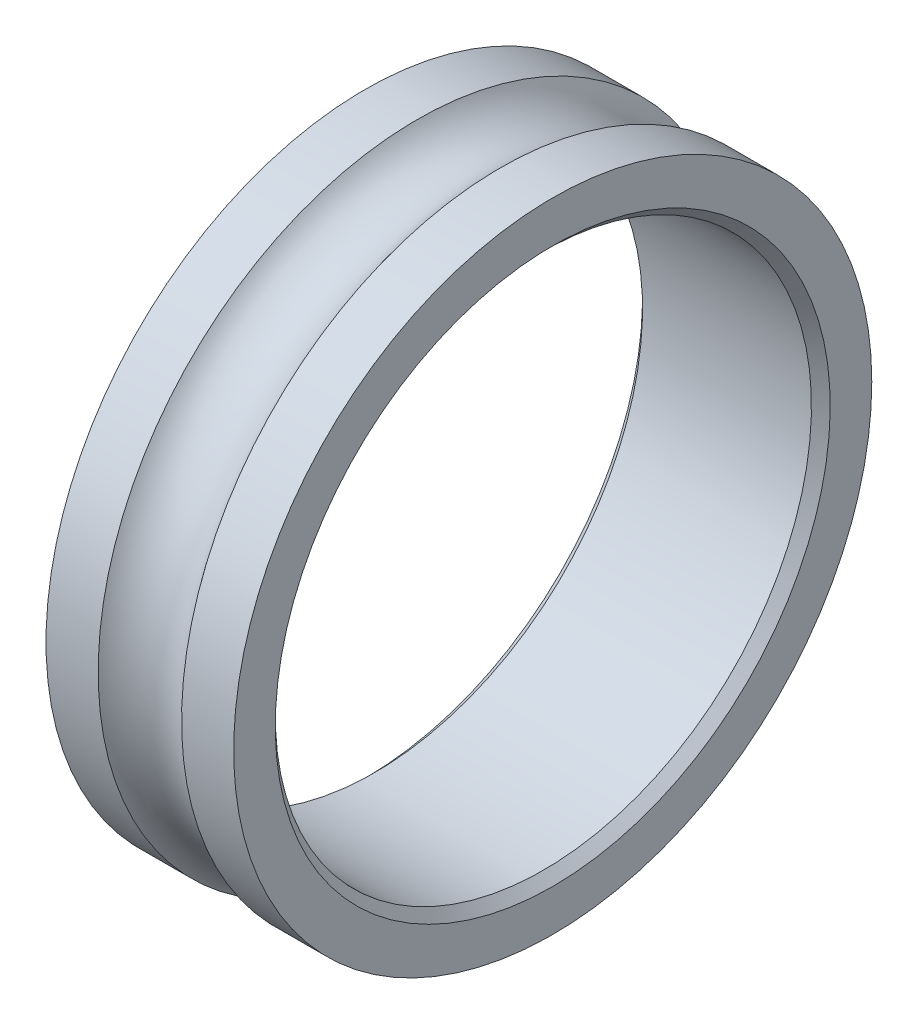
ISO-10303-21;
HEADER;
FILE_DESCRIPTION(('STEP AP214'),'2;1');
FILE_NAME('part.step','',(''),(''),'','','');
FILE_SCHEMA(('AUTOMOTIVE_DESIGN { 1 0 10303 214 1 1 1 1 }'));
ENDSEC;
DATA;
#1=APPLICATION_CONTEXT('core data for automotive mechanical design processes');
#2=APPLICATION_PROTOCOL_DEFINITION('international standard','automotive_design',2000,#1);
#3=PRODUCT_CONTEXT('',#1,'mechanical');
#4=PRODUCT('Part','Part','',(#3));
#5=PRODUCT_RELATED_PRODUCT_CATEGORY('part','',(#4));
#6=PRODUCT_DEFINITION_FORMATION('','',#4);
#7=PRODUCT_DEFINITION_CONTEXT('part definition',#1,'design');
#8=PRODUCT_DEFINITION('design','',#6,#7);
#9=PRODUCT_DEFINITION_SHAPE('','',#8);
#10=(LENGTH_UNIT() NAMED_UNIT(*) SI_UNIT(.MILLI.,.METRE.));
#11=(NAMED_UNIT(*) PLANE_ANGLE_UNIT() SI_UNIT($,.RADIAN.));
#12=(NAMED_UNIT(*) SI_UNIT($,.STERADIAN.) SOLID_ANGLE_UNIT());
#13=UNCERTAINTY_MEASURE_WITH_UNIT(LENGTH_MEASURE(1.E-05),#10,'distance_accuracy_value','');
#14=(GEOMETRIC_REPRESENTATION_CONTEXT(3) GLOBAL_UNCERTAINTY_ASSIGNED_CONTEXT((#13)) GLOBAL_UNIT_ASSIGNED_CONTEXT((#10,
#11,#12)) REPRESENTATION_CONTEXT('',''));
#15=CARTESIAN_POINT('',(0.,0.,0.));
#16=DIRECTION('',(0.,0.,1.));
#17=DIRECTION('',(1.,0.,0.));
#18=AXIS2_PLACEMENT_3D('',#15,#16,#17);
#19=CARTESIAN_POINT('',(4.525,0.,0.));
#20=DIRECTION('',(1.,0.,0.));
#21=DIRECTION('',(0.,0.963910606013732,-0.266226113697059));
#22=AXIS2_PLACEMENT_3D('',#19,#20,#21);
#23=TOROIDAL_SURFACE('',#22,13.,1.90455682813241);
#24=CARTESIAN_POINT('',(6.08055555555556,0.,0.));
#25=DIRECTION('',(1.,0.,0.));
#26=DIRECTION('',(0.,0.963910606013732,-0.266226113697059));
#27=AXIS2_PLACEMENT_3D('',#24,#25,#26);
#28=CIRCLE('',#27,11.9010989010989);
#29=CARTESIAN_POINT('',(6.08055555555556,11.4715954539876,-3.1683833091639));
#30=VERTEX_POINT('',#29);
#31=EDGE_CURVE('E40',#30,#30,#28,.T.);
#32=ORIENTED_EDGE('',*,*,#31,.F.);
#33=EDGE_LOOP('',(#32));
#34=FACE_BOUND('',#33,.T.);
#35=CARTESIAN_POINT('',(2.96944444444445,0.,0.));
#36=DIRECTION('',(1.,0.,0.));
#37=DIRECTION('',(0.,0.963910606013732,-0.266226113697059));
#38=AXIS2_PLACEMENT_3D('',#35,#36,#37);
#39=CIRCLE('',#38,11.9010989010989);
#40=CARTESIAN_POINT('',(2.96944444444445,11.4715954539876,-3.1683833091639));
#41=VERTEX_POINT('',#40);
#42=EDGE_CURVE('E32',#41,#41,#39,.T.);
#43=ORIENTED_EDGE('',*,*,#42,.T.);
#44=EDGE_LOOP('',(#43));
#45=FACE_BOUND('',#44,.T.);
#46=ADVANCED_FACE('F15',(#34,#45),#23,.F.);
#47=CARTESIAN_POINT('',(8.025,0.,0.));
#48=DIRECTION('',(1.,0.,0.));
#49=DIRECTION('',(0.,0.963910606013732,-0.266226113697059));
#50=AXIS2_PLACEMENT_3D('',#47,#48,#49);
#51=CONICAL_SURFACE('',#50,10.35,0.785398163397452);
#52=CARTESIAN_POINT('',(7.675,0.,0.));
#53=DIRECTION('',(1.,0.,0.));
#54=DIRECTION('',(0.,0.963910606013732,-0.266226113697059));
#55=AXIS2_PLACEMENT_3D('',#52,#53,#54);
#56=CIRCLE('',#55,10.);
#57=CARTESIAN_POINT('',(7.675,9.63910606013732,-2.66226113697059));
#58=VERTEX_POINT('',#57);
#59=EDGE_CURVE('E10',#58,#58,#56,.T.);
#60=ORIENTED_EDGE('',*,*,#59,.F.);
#61=EDGE_LOOP('',(#60));
#62=FACE_BOUND('',#61,.T.);
#63=CARTESIAN_POINT('',(8.025,0.,0.));
#64=DIRECTION('',(1.,0.,0.));
#65=DIRECTION('',(0.,0.963910606013732,-0.266226113697059));
#66=AXIS2_PLACEMENT_3D('',#63,#64,#65);
#67=CIRCLE('',#66,10.35);
#68=CARTESIAN_POINT('',(8.025,9.97647477224213,-2.75544027676456));
#69=VERTEX_POINT('',#68);
#70=EDGE_CURVE('E45',#69,#69,#67,.T.);
#71=ORIENTED_EDGE('',*,*,#70,.T.);
#72=EDGE_LOOP('',(#71));
#73=FACE_BOUND('',#72,.T.);
#74=ADVANCED_FACE('F17',(#62,#73),#51,.F.);
#75=CARTESIAN_POINT('',(8.025,0.,0.));
#76=DIRECTION('',(1.,0.,0.));
#77=DIRECTION('',(0.,0.963910606013732,-0.266226113697059));
#78=AXIS2_PLACEMENT_3D('',#75,#76,#77);
#79=CYLINDRICAL_SURFACE('',#78,10.);
#80=CARTESIAN_POINT('',(1.375,0.,0.));
#81=DIRECTION('',(1.,0.,0.));
#82=DIRECTION('',(0.,0.963910606013732,-0.266226113697059));
#83=AXIS2_PLACEMENT_3D('',#80,#81,#82);
#84=CIRCLE('',#83,10.);
#85=CARTESIAN_POINT('',(1.375,9.63910606013732,-2.66226113697059));
#86=VERTEX_POINT('',#85);
#87=EDGE_CURVE('E23',#86,#86,#84,.T.);
#88=ORIENTED_EDGE('',*,*,#87,.F.);
#89=EDGE_LOOP('',(#88));
#90=FACE_BOUND('',#89,.T.);
#91=ORIENTED_EDGE('',*,*,#59,.T.);
#92=EDGE_LOOP('',(#91));
#93=FACE_BOUND('',#92,.T.);
#94=ADVANCED_FACE('F69',(#90,#93),#79,.F.);
#95=CARTESIAN_POINT('',(1.375,0.,0.));
#96=DIRECTION('',(-1.,0.,0.));
#97=DIRECTION('',(0.,-0.963910606013732,0.266226113697059));
#98=AXIS2_PLACEMENT_3D('',#95,#96,#97);
#99=CONICAL_SURFACE('',#98,10.,0.785398163397446);
#100=ORIENTED_EDGE('',*,*,#87,.T.);
#101=EDGE_LOOP('',(#100));
#102=FACE_BOUND('',#101,.T.);
#103=CARTESIAN_POINT('',(1.025,0.,0.));
#104=DIRECTION('',(1.,0.,0.));
#105=DIRECTION('',(0.,0.963910606013732,-0.266226113697059));
#106=AXIS2_PLACEMENT_3D('',#103,#104,#105);
#107=CIRCLE('',#106,10.35);
#108=CARTESIAN_POINT('',(1.025,9.97647477224213,-2.75544027676456));
#109=VERTEX_POINT('',#108);
#110=EDGE_CURVE('E54',#109,#109,#107,.T.);
#111=ORIENTED_EDGE('',*,*,#110,.F.);
#112=EDGE_LOOP('',(#111));
#113=FACE_BOUND('',#112,.T.);
#114=ADVANCED_FACE('F66',(#102,#113),#99,.F.);
#115=CARTESIAN_POINT('',(8.025,0.,0.));
#116=DIRECTION('',(1.,0.,0.));
#117=DIRECTION('',(0.,0.963910606013732,-0.266226113697059));
#118=AXIS2_PLACEMENT_3D('',#115,#116,#117);
#119=CYLINDRICAL_SURFACE('',#118,11.9010989010989);
#120=CARTESIAN_POINT('',(1.025,0.,0.));
#121=DIRECTION('',(1.,0.,0.));
#122=DIRECTION('',(0.,0.963910606013732,-0.266226113697059));
#123=AXIS2_PLACEMENT_3D('',#120,#121,#122);
#124=CIRCLE('',#123,11.9010989010989);
#125=CARTESIAN_POINT('',(1.025,11.4715954539876,-3.1683833091639));
#126=VERTEX_POINT('',#125);
#127=EDGE_CURVE('E50',#126,#126,#124,.T.);
#128=ORIENTED_EDGE('',*,*,#127,.T.);
#129=EDGE_LOOP('',(#128));
#130=FACE_BOUND('',#129,.T.);
#131=ORIENTED_EDGE('',*,*,#42,.F.);
#132=EDGE_LOOP('',(#131));
#133=FACE_BOUND('',#132,.T.);
#134=ADVANCED_FACE('F68',(#130,#133),#119,.T.);
#135=CARTESIAN_POINT('',(8.025,0.,0.));
#136=DIRECTION('',(1.,0.,0.));
#137=DIRECTION('',(0.,0.963910606013732,-0.266226113697059));
#138=AXIS2_PLACEMENT_3D('',#135,#136,#137);
#139=CYLINDRICAL_SURFACE('',#138,11.9010989010989);
#140=ORIENTED_EDGE('',*,*,#31,.T.);
#141=EDGE_LOOP('',(#140));
#142=FACE_BOUND('',#141,.T.);
#143=CARTESIAN_POINT('',(8.025,0.,0.));
#144=DIRECTION('',(1.,0.,0.));
#145=DIRECTION('',(0.,0.963910606013732,-0.266226113697059));
#146=AXIS2_PLACEMENT_3D('',#143,#144,#145);
#147=CIRCLE('',#146,11.9010989010989);
#148=CARTESIAN_POINT('',(8.025,11.4715954539876,-3.1683833091639));
#149=VERTEX_POINT('',#148);
#150=EDGE_CURVE('E49',#149,#149,#147,.T.);
#151=ORIENTED_EDGE('',*,*,#150,.F.);
#152=EDGE_LOOP('',(#151));
#153=FACE_BOUND('',#152,.T.);
#154=ADVANCED_FACE('F76',(#142,#153),#139,.T.);
#155=CARTESIAN_POINT('',(8.025,3.16838330916389,11.4715954539876));
#156=DIRECTION('',(-1.,0.,0.));
#157=DIRECTION('',(0.,0.,1.));
#158=AXIS2_PLACEMENT_3D('',#155,#156,#157);
#159=PLANE('',#158);
#160=ORIENTED_EDGE('',*,*,#70,.F.);
#161=EDGE_LOOP('',(#160));
#162=FACE_BOUND('',#161,.T.);
#163=ORIENTED_EDGE('',*,*,#150,.T.);
#164=EDGE_LOOP('',(#163));
#165=FACE_BOUND('',#164,.T.);
#166=ADVANCED_FACE('F92',(#162,#165),#159,.F.);
#167=CARTESIAN_POINT('',(1.025,2.75544027676455,9.97647477224213));
#168=DIRECTION('',(1.,0.,0.));
#169=DIRECTION('',(0.,0.,1.));
#170=AXIS2_PLACEMENT_3D('',#167,#168,#169);
#171=PLANE('',#170);
#172=ORIENTED_EDGE('',*,*,#127,.F.);
#173=EDGE_LOOP('',(#172));
#174=FACE_BOUND('',#173,.T.);
#175=ORIENTED_EDGE('',*,*,#110,.T.);
#176=EDGE_LOOP('',(#175));
#177=FACE_BOUND('',#176,.T.);
#178=ADVANCED_FACE('F64',(#174,#177),#171,.F.);
#179=CLOSED_SHELL('',(#46,#74,#94,#114,#134,#154,#166,#178));
#180=MANIFOLD_SOLID_BREP('B1',#179);
#181=ADVANCED_BREP_SHAPE_REPRESENTATION('',(#18,#180),#14);
#182=SHAPE_DEFINITION_REPRESENTATION(#9,#181);
ENDSEC;
END-ISO-10303-21;
